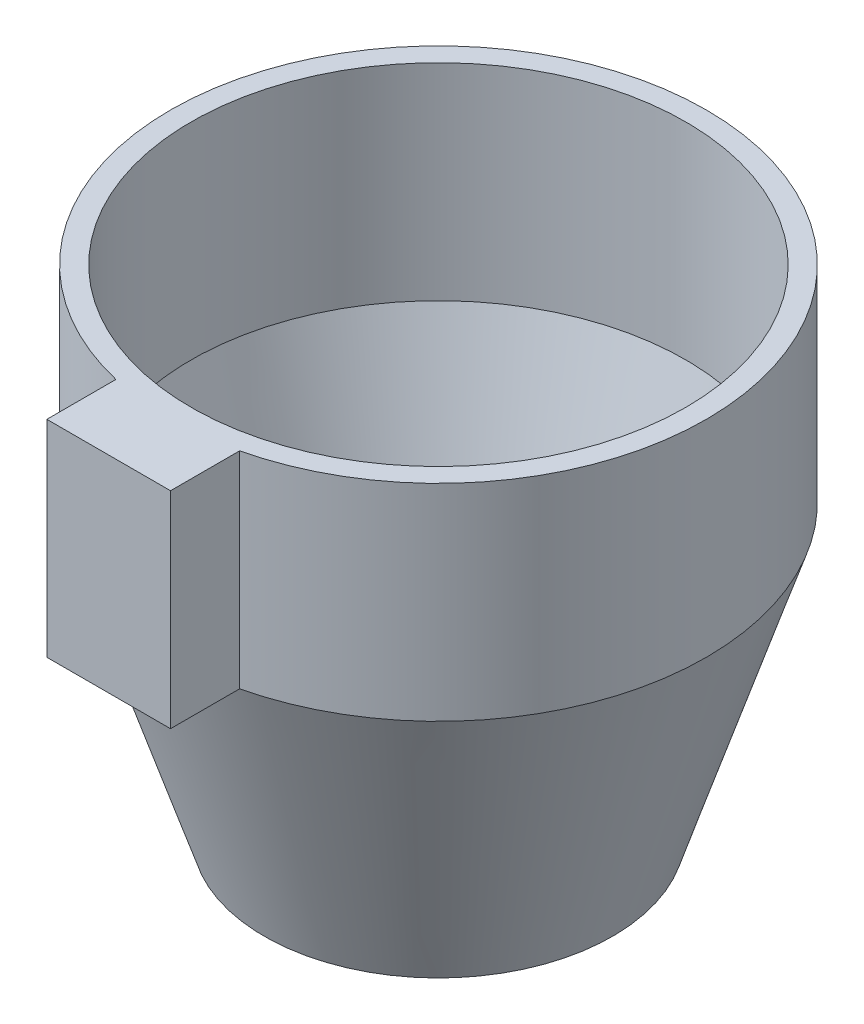
ISO-10303-21;
HEADER;
FILE_DESCRIPTION(('STEP AP214'),'2;1');
FILE_NAME('part.step','',(''),(''),'','','');
FILE_SCHEMA(('AUTOMOTIVE_DESIGN { 1 0 10303 214 1 1 1 1 }'));
ENDSEC;
DATA;
#1=APPLICATION_CONTEXT('core data for automotive mechanical design processes');
#2=APPLICATION_PROTOCOL_DEFINITION('international standard','automotive_design',2000,#1);
#3=PRODUCT_CONTEXT('',#1,'mechanical');
#4=PRODUCT('Part','Part','',(#3));
#5=PRODUCT_RELATED_PRODUCT_CATEGORY('part','',(#4));
#6=PRODUCT_DEFINITION_FORMATION('','',#4);
#7=PRODUCT_DEFINITION_CONTEXT('part definition',#1,'design');
#8=PRODUCT_DEFINITION('design','',#6,#7);
#9=PRODUCT_DEFINITION_SHAPE('','',#8);
#10=(LENGTH_UNIT() NAMED_UNIT(*) SI_UNIT(.MILLI.,.METRE.));
#11=(NAMED_UNIT(*) PLANE_ANGLE_UNIT() SI_UNIT($,.RADIAN.));
#12=(NAMED_UNIT(*) SI_UNIT($,.STERADIAN.) SOLID_ANGLE_UNIT());
#13=UNCERTAINTY_MEASURE_WITH_UNIT(LENGTH_MEASURE(1.E-05),#10,'distance_accuracy_value','');
#14=(GEOMETRIC_REPRESENTATION_CONTEXT(3) GLOBAL_UNCERTAINTY_ASSIGNED_CONTEXT((#13)) GLOBAL_UNIT_ASSIGNED_CONTEXT((#10,
#11,#12)) REPRESENTATION_CONTEXT('',''));
#15=CARTESIAN_POINT('',(0.,0.,0.));
#16=DIRECTION('',(0.,0.,1.));
#17=DIRECTION('',(1.,0.,0.));
#18=AXIS2_PLACEMENT_3D('',#15,#16,#17);
#19=CARTESIAN_POINT('',(0.,50.,0.));
#20=DIRECTION('',(0.,-1.,0.));
#21=DIRECTION('',(0.,0.,-1.));
#22=AXIS2_PLACEMENT_3D('',#19,#20,#21);
#23=CYLINDRICAL_SURFACE('',#22,65.);
#24=DIRECTION('',(0.,-1.,0.));
#25=VECTOR('',#24,1.);
#26=CARTESIAN_POINT('',(15.,50.,63.2455532033676));
#27=LINE('',#26,#25);
#28=CARTESIAN_POINT('',(15.,0.,63.2455532033676));
#29=VERTEX_POINT('',#28);
#30=CARTESIAN_POINT('',(15.,50.,63.2455532033676));
#31=VERTEX_POINT('',#30);
#32=EDGE_CURVE('E65',#29,#31,#27,.F.);
#33=ORIENTED_EDGE('',*,*,#32,.F.);
#34=CARTESIAN_POINT('',(0.,0.,0.));
#35=DIRECTION('',(0.,-1.,0.));
#36=DIRECTION('',(0.,0.,-1.));
#37=AXIS2_PLACEMENT_3D('',#34,#35,#36);
#38=CIRCLE('',#37,65.);
#39=CARTESIAN_POINT('',(-15.,0.,63.2455532033676));
#40=VERTEX_POINT('',#39);
#41=EDGE_CURVE('E119',#40,#29,#38,.T.);
#42=ORIENTED_EDGE('',*,*,#41,.F.);
#43=DIRECTION('',(0.,-1.,0.));
#44=VECTOR('',#43,1.);
#45=CARTESIAN_POINT('',(-15.,50.,63.2455532033676));
#46=LINE('',#45,#44);
#47=CARTESIAN_POINT('',(-15.,50.,63.2455532033676));
#48=VERTEX_POINT('',#47);
#49=EDGE_CURVE('E93',#48,#40,#46,.T.);
#50=ORIENTED_EDGE('',*,*,#49,.F.);
#51=CARTESIAN_POINT('',(0.,50.,0.));
#52=DIRECTION('',(0.,1.,0.));
#53=DIRECTION('',(0.,0.,1.));
#54=AXIS2_PLACEMENT_3D('',#51,#52,#53);
#55=CIRCLE('',#54,65.);
#56=EDGE_CURVE('E12',#31,#48,#55,.T.);
#57=ORIENTED_EDGE('',*,*,#56,.F.);
#58=EDGE_LOOP('',(#33,#42,#50,#57));
#59=FACE_BOUND('',#58,.T.);
#60=ADVANCED_FACE('F43',(#59),#23,.T.);
#61=CARTESIAN_POINT('',(0.,50.,0.));
#62=DIRECTION('',(0.,1.,0.));
#63=DIRECTION('',(0.,0.,1.));
#64=AXIS2_PLACEMENT_3D('',#61,#62,#63);
#65=PLANE('',#64);
#66=DIRECTION('',(0.,0.,-1.));
#67=VECTOR('',#66,1.);
#68=CARTESIAN_POINT('',(15.,50.,60.));
#69=LINE('',#68,#67);
#70=CARTESIAN_POINT('',(15.,50.,80.));
#71=VERTEX_POINT('',#70);
#72=EDGE_CURVE('E94',#71,#31,#69,.T.);
#73=ORIENTED_EDGE('',*,*,#72,.T.);
#74=ORIENTED_EDGE('',*,*,#56,.T.);
#75=DIRECTION('',(0.,0.,1.));
#76=VECTOR('',#75,1.);
#77=CARTESIAN_POINT('',(-15.,50.,60.));
#78=LINE('',#77,#76);
#79=CARTESIAN_POINT('',(-15.,50.,80.));
#80=VERTEX_POINT('',#79);
#81=EDGE_CURVE('E84',#48,#80,#78,.T.);
#82=ORIENTED_EDGE('',*,*,#81,.T.);
#83=DIRECTION('',(1.,0.,0.));
#84=VECTOR('',#83,1.);
#85=CARTESIAN_POINT('',(-15.,50.,80.));
#86=LINE('',#85,#84);
#87=EDGE_CURVE('E89',#80,#71,#86,.T.);
#88=ORIENTED_EDGE('',*,*,#87,.T.);
#89=EDGE_LOOP('',(#73,#74,#82,#88));
#90=FACE_BOUND('',#89,.T.);
#91=CARTESIAN_POINT('',(0.,50.,0.));
#92=DIRECTION('',(0.,1.,0.));
#93=DIRECTION('',(1.,0.,0.));
#94=AXIS2_PLACEMENT_3D('',#91,#92,#93);
#95=CIRCLE('',#94,60.);
#96=CARTESIAN_POINT('',(60.,50.,0.));
#97=VERTEX_POINT('',#96);
#98=EDGE_CURVE('E50',#97,#97,#95,.T.);
#99=ORIENTED_EDGE('',*,*,#98,.F.);
#100=EDGE_LOOP('',(#99));
#101=FACE_BOUND('',#100,.T.);
#102=ADVANCED_FACE('F86',(#90,#101),#65,.T.);
#103=CARTESIAN_POINT('',(0.,50.,0.));
#104=DIRECTION('',(0.,-1.,0.));
#105=DIRECTION('',(0.,0.,-1.));
#106=AXIS2_PLACEMENT_3D('',#103,#104,#105);
#107=CYLINDRICAL_SURFACE('',#106,60.);
#108=CARTESIAN_POINT('',(0.,0.,0.));
#109=DIRECTION('',(0.,1.,0.));
#110=DIRECTION('',(1.,0.,0.));
#111=AXIS2_PLACEMENT_3D('',#108,#109,#110);
#112=CIRCLE('',#111,60.);
#113=CARTESIAN_POINT('',(60.,0.,0.));
#114=VERTEX_POINT('',#113);
#115=EDGE_CURVE('E123',#114,#114,#112,.T.);
#116=ORIENTED_EDGE('',*,*,#115,.F.);
#117=EDGE_LOOP('',(#116));
#118=FACE_BOUND('',#117,.T.);
#119=ORIENTED_EDGE('',*,*,#98,.T.);
#120=EDGE_LOOP('',(#119));
#121=FACE_BOUND('',#120,.T.);
#122=ADVANCED_FACE('F131',(#118,#121),#107,.F.);
#123=CARTESIAN_POINT('',(0.,0.,0.));
#124=DIRECTION('',(0.,1.,0.));
#125=DIRECTION('',(0.,0.,1.));
#126=AXIS2_PLACEMENT_3D('',#123,#124,#125);
#127=CONICAL_SURFACE('',#126,65.,0.314159265358984);
#128=CARTESIAN_POINT('',(0.,-70.,0.));
#129=DIRECTION('',(0.,-1.,0.));
#130=DIRECTION('',(0.,0.,-1.));
#131=AXIS2_PLACEMENT_3D('',#128,#129,#130);
#132=CIRCLE('',#131,42.2556212636962);
#133=CARTESIAN_POINT('',(0.,-70.,-42.2556212636962));
#134=VERTEX_POINT('',#133);
#135=EDGE_CURVE('E113',#134,#134,#132,.T.);
#136=ORIENTED_EDGE('',*,*,#135,.F.);
#137=EDGE_LOOP('',(#136));
#138=FACE_BOUND('',#137,.T.);
#139=EDGE_CURVE('E120',#29,#40,#38,.T.);
#140=ORIENTED_EDGE('',*,*,#139,.T.);
#141=ORIENTED_EDGE('',*,*,#41,.T.);
#142=EDGE_LOOP('',(#140,#141));
#143=FACE_BOUND('',#142,.T.);
#144=ADVANCED_FACE('F134',(#138,#143),#127,.T.);
#145=CARTESIAN_POINT('',(0.,-70.,0.));
#146=DIRECTION('',(0.,1.,0.));
#147=DIRECTION('',(0.,0.,1.));
#148=AXIS2_PLACEMENT_3D('',#145,#146,#147);
#149=CONICAL_SURFACE('',#148,37.2556212636962,0.314159265358984);
#150=ORIENTED_EDGE('',*,*,#115,.T.);
#151=EDGE_LOOP('',(#150));
#152=FACE_BOUND('',#151,.T.);
#153=CARTESIAN_POINT('',(0.,-70.,0.));
#154=DIRECTION('',(0.,-1.,0.));
#155=DIRECTION('',(0.,0.,-1.));
#156=AXIS2_PLACEMENT_3D('',#153,#154,#155);
#157=CIRCLE('',#156,37.2556212636962);
#158=CARTESIAN_POINT('',(0.,-70.,-37.2556212636962));
#159=VERTEX_POINT('',#158);
#160=EDGE_CURVE('E116',#159,#159,#157,.T.);
#161=ORIENTED_EDGE('',*,*,#160,.T.);
#162=EDGE_LOOP('',(#161));
#163=FACE_BOUND('',#162,.T.);
#164=ADVANCED_FACE('F128',(#152,#163),#149,.F.);
#165=CARTESIAN_POINT('',(0.,-70.,37.2556212636962));
#166=DIRECTION('',(0.,1.,0.));
#167=DIRECTION('',(0.,0.,1.));
#168=AXIS2_PLACEMENT_3D('',#165,#166,#167);
#169=PLANE('',#168);
#170=ORIENTED_EDGE('',*,*,#160,.F.);
#171=EDGE_LOOP('',(#170));
#172=FACE_BOUND('',#171,.T.);
#173=ORIENTED_EDGE('',*,*,#135,.T.);
#174=EDGE_LOOP('',(#173));
#175=FACE_BOUND('',#174,.T.);
#176=ADVANCED_FACE('F148',(#172,#175),#169,.F.);
#177=CARTESIAN_POINT('',(15.,86.0555127546399,60.));
#178=DIRECTION('',(-1.,0.,0.));
#179=DIRECTION('',(0.,0.,1.));
#180=AXIS2_PLACEMENT_3D('',#177,#178,#179);
#181=PLANE('',#180);
#182=DIRECTION('',(0.,0.,-1.));
#183=VECTOR('',#182,1.);
#184=CARTESIAN_POINT('',(15.,0.,60.));
#185=LINE('',#184,#183);
#186=CARTESIAN_POINT('',(15.,0.,80.));
#187=VERTEX_POINT('',#186);
#188=EDGE_CURVE('E110',#187,#29,#185,.T.);
#189=ORIENTED_EDGE('',*,*,#188,.T.);
#190=ORIENTED_EDGE('',*,*,#32,.T.);
#191=ORIENTED_EDGE('',*,*,#72,.F.);
#192=DIRECTION('',(0.,-1.,0.));
#193=VECTOR('',#192,1.);
#194=CARTESIAN_POINT('',(15.,86.0555127546399,80.));
#195=LINE('',#194,#193);
#196=EDGE_CURVE('E104',#71,#187,#195,.T.);
#197=ORIENTED_EDGE('',*,*,#196,.T.);
#198=EDGE_LOOP('',(#189,#190,#191,#197));
#199=FACE_BOUND('',#198,.T.);
#200=ADVANCED_FACE('F151',(#199),#181,.F.);
#201=CARTESIAN_POINT('',(-15.,86.0555127546399,60.));
#202=DIRECTION('',(1.,0.,0.));
#203=DIRECTION('',(0.,0.,-1.));
#204=AXIS2_PLACEMENT_3D('',#201,#202,#203);
#205=PLANE('',#204);
#206=ORIENTED_EDGE('',*,*,#81,.F.);
#207=ORIENTED_EDGE('',*,*,#49,.T.);
#208=DIRECTION('',(0.,0.,1.));
#209=VECTOR('',#208,1.);
#210=CARTESIAN_POINT('',(-15.,0.,60.));
#211=LINE('',#210,#209);
#212=CARTESIAN_POINT('',(-15.,0.,80.));
#213=VERTEX_POINT('',#212);
#214=EDGE_CURVE('E57',#40,#213,#211,.T.);
#215=ORIENTED_EDGE('',*,*,#214,.T.);
#216=DIRECTION('',(0.,-1.,0.));
#217=VECTOR('',#216,1.);
#218=CARTESIAN_POINT('',(-15.,86.0555127546399,80.));
#219=LINE('',#218,#217);
#220=EDGE_CURVE('E97',#80,#213,#219,.T.);
#221=ORIENTED_EDGE('',*,*,#220,.F.);
#222=EDGE_LOOP('',(#206,#207,#215,#221));
#223=FACE_BOUND('',#222,.T.);
#224=ADVANCED_FACE('F98',(#223),#205,.F.);
#225=CARTESIAN_POINT('',(0.,0.,0.));
#226=DIRECTION('',(0.,1.,0.));
#227=DIRECTION('',(0.,0.,1.));
#228=AXIS2_PLACEMENT_3D('',#225,#226,#227);
#229=PLANE('',#228);
#230=ORIENTED_EDGE('',*,*,#214,.F.);
#231=ORIENTED_EDGE('',*,*,#139,.F.);
#232=ORIENTED_EDGE('',*,*,#188,.F.);
#233=DIRECTION('',(1.,0.,0.));
#234=VECTOR('',#233,1.);
#235=CARTESIAN_POINT('',(-15.,0.,80.));
#236=LINE('',#235,#234);
#237=EDGE_CURVE('E101',#213,#187,#236,.T.);
#238=ORIENTED_EDGE('',*,*,#237,.F.);
#239=EDGE_LOOP('',(#230,#231,#232,#238));
#240=FACE_BOUND('',#239,.T.);
#241=ADVANCED_FACE('F157',(#240),#229,.F.);
#242=CARTESIAN_POINT('',(-15.,86.0555127546399,80.));
#243=DIRECTION('',(0.,0.,-1.));
#244=DIRECTION('',(-1.,0.,0.));
#245=AXIS2_PLACEMENT_3D('',#242,#243,#244);
#246=PLANE('',#245);
#247=ORIENTED_EDGE('',*,*,#87,.F.);
#248=ORIENTED_EDGE('',*,*,#220,.T.);
#249=ORIENTED_EDGE('',*,*,#237,.T.);
#250=ORIENTED_EDGE('',*,*,#196,.F.);
#251=EDGE_LOOP('',(#247,#248,#249,#250));
#252=FACE_BOUND('',#251,.T.);
#253=ADVANCED_FACE('F103',(#252),#246,.F.);
#254=CLOSED_SHELL('',(#60,#102,#122,#144,#164,#176,#200,#224,#241,#253));
#255=MANIFOLD_SOLID_BREP('B2',#254);
#256=ADVANCED_BREP_SHAPE_REPRESENTATION('',(#18,#255),#14);
#257=SHAPE_DEFINITION_REPRESENTATION(#9,#256);
ENDSEC;
END-ISO-10303-21;
